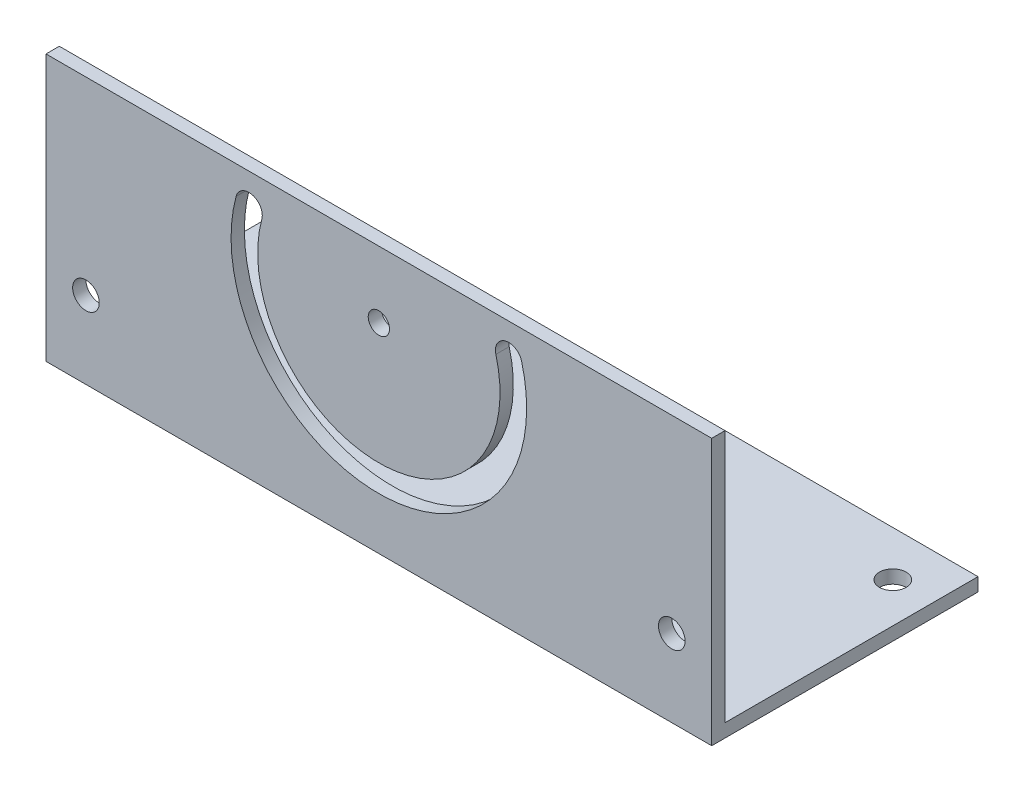
ISO-10303-21;
HEADER;
FILE_DESCRIPTION(('STEP AP214'),'2;1');
FILE_NAME('part.step','',(''),(''),'','','');
FILE_SCHEMA(('AUTOMOTIVE_DESIGN { 1 0 10303 214 1 1 1 1 }'));
ENDSEC;
DATA;
#1=APPLICATION_CONTEXT('core data for automotive mechanical design processes');
#2=APPLICATION_PROTOCOL_DEFINITION('international standard','automotive_design',2000,#1);
#3=PRODUCT_CONTEXT('',#1,'mechanical');
#4=PRODUCT('Part','Part','',(#3));
#5=PRODUCT_RELATED_PRODUCT_CATEGORY('part','',(#4));
#6=PRODUCT_DEFINITION_FORMATION('','',#4);
#7=PRODUCT_DEFINITION_CONTEXT('part definition',#1,'design');
#8=PRODUCT_DEFINITION('design','',#6,#7);
#9=PRODUCT_DEFINITION_SHAPE('','',#8);
#10=(LENGTH_UNIT() NAMED_UNIT(*) SI_UNIT(.MILLI.,.METRE.));
#11=(NAMED_UNIT(*) PLANE_ANGLE_UNIT() SI_UNIT($,.RADIAN.));
#12=(NAMED_UNIT(*) SI_UNIT($,.STERADIAN.) SOLID_ANGLE_UNIT());
#13=UNCERTAINTY_MEASURE_WITH_UNIT(LENGTH_MEASURE(1.E-05),#10,'distance_accuracy_value','');
#14=(GEOMETRIC_REPRESENTATION_CONTEXT(3) GLOBAL_UNCERTAINTY_ASSIGNED_CONTEXT((#13)) GLOBAL_UNIT_ASSIGNED_CONTEXT((#10,
#11,#12)) REPRESENTATION_CONTEXT('',''));
#15=CARTESIAN_POINT('',(0.,0.,0.));
#16=DIRECTION('',(0.,0.,1.));
#17=DIRECTION('',(1.,0.,0.));
#18=AXIS2_PLACEMENT_3D('',#15,#16,#17);
#19=CARTESIAN_POINT('',(15.,75.,0.));
#20=DIRECTION('',(0.,0.,-1.));
#21=DIRECTION('',(-1.,0.,0.));
#22=AXIS2_PLACEMENT_3D('',#19,#20,#21);
#23=CYLINDRICAL_SURFACE('',#22,55.5);
#24=DIRECTION('',(0.,0.,-1.));
#25=VECTOR('',#24,1.);
#26=CARTESIAN_POINT('',(-38.6088833590433,89.3644570031899,0.));
#27=LINE('',#26,#25);
#28=CARTESIAN_POINT('',(-38.6088833590433,89.3644570031899,-5.));
#29=VERTEX_POINT('',#28);
#30=CARTESIAN_POINT('',(-38.6088833590433,89.3644570031899,0.));
#31=VERTEX_POINT('',#30);
#32=EDGE_CURVE('E219',#29,#31,#27,.F.);
#33=ORIENTED_EDGE('',*,*,#32,.T.);
#34=CARTESIAN_POINT('',(15.,75.,0.));
#35=DIRECTION('',(0.,0.,-1.));
#36=DIRECTION('',(-1.,0.,0.));
#37=AXIS2_PLACEMENT_3D('',#34,#35,#36);
#38=CIRCLE('',#37,55.5);
#39=CARTESIAN_POINT('',(68.6088833590433,89.3644570031899,0.));
#40=VERTEX_POINT('',#39);
#41=EDGE_CURVE('E241',#40,#31,#38,.T.);
#42=ORIENTED_EDGE('',*,*,#41,.F.);
#43=DIRECTION('',(0.,0.,-1.));
#44=VECTOR('',#43,1.);
#45=CARTESIAN_POINT('',(68.6088833590433,89.3644570031899,0.));
#46=LINE('',#45,#44);
#47=CARTESIAN_POINT('',(68.6088833590433,89.3644570031899,-5.));
#48=VERTEX_POINT('',#47);
#49=EDGE_CURVE('E255',#40,#48,#46,.T.);
#50=ORIENTED_EDGE('',*,*,#49,.T.);
#51=CARTESIAN_POINT('',(15.,75.,-5.));
#52=DIRECTION('',(0.,0.,-1.));
#53=DIRECTION('',(0.,1.,0.));
#54=AXIS2_PLACEMENT_3D('',#51,#52,#53);
#55=CIRCLE('',#54,55.5);
#56=EDGE_CURVE('E157',#29,#48,#55,.F.);
#57=ORIENTED_EDGE('',*,*,#56,.F.);
#58=EDGE_LOOP('',(#33,#42,#50,#57));
#59=FACE_BOUND('',#58,.T.);
#60=ADVANCED_FACE('F49',(#59),#23,.F.);
#61=CARTESIAN_POINT('',(-33.779254227598,88.0703617776773,0.));
#62=DIRECTION('',(0.,0.,-1.));
#63=DIRECTION('',(-1.,0.,0.));
#64=AXIS2_PLACEMENT_3D('',#61,#62,#63);
#65=CYLINDRICAL_SURFACE('',#64,5.);
#66=DIRECTION('',(0.,0.,-1.));
#67=VECTOR('',#66,1.);
#68=CARTESIAN_POINT('',(-28.9496250961526,86.7762665521647,0.));
#69=LINE('',#68,#67);
#70=CARTESIAN_POINT('',(-28.9496250961526,86.7762665521647,0.));
#71=VERTEX_POINT('',#70);
#72=CARTESIAN_POINT('',(-28.9496250961526,86.7762665521647,-5.));
#73=VERTEX_POINT('',#72);
#74=EDGE_CURVE('E256',#71,#73,#69,.T.);
#75=ORIENTED_EDGE('',*,*,#74,.F.);
#76=CARTESIAN_POINT('',(-33.779254227598,88.0703617776773,0.));
#77=DIRECTION('',(0.,0.,-1.));
#78=DIRECTION('',(-1.,0.,0.));
#79=AXIS2_PLACEMENT_3D('',#76,#77,#78);
#80=CIRCLE('',#79,5.);
#81=EDGE_CURVE('E267',#31,#71,#80,.T.);
#82=ORIENTED_EDGE('',*,*,#81,.F.);
#83=ORIENTED_EDGE('',*,*,#32,.F.);
#84=CARTESIAN_POINT('',(-33.779254227598,88.0703617776773,-5.));
#85=DIRECTION('',(0.,0.,-1.));
#86=DIRECTION('',(0.,1.,0.));
#87=AXIS2_PLACEMENT_3D('',#84,#85,#86);
#88=CIRCLE('',#87,5.);
#89=EDGE_CURVE('E274',#73,#29,#88,.F.);
#90=ORIENTED_EDGE('',*,*,#89,.F.);
#91=EDGE_LOOP('',(#75,#82,#83,#90));
#92=FACE_BOUND('',#91,.T.);
#93=ADVANCED_FACE('F454',(#92),#65,.F.);
#94=CARTESIAN_POINT('',(15.,75.,0.));
#95=DIRECTION('',(0.,0.,-1.));
#96=DIRECTION('',(-1.,0.,0.));
#97=AXIS2_PLACEMENT_3D('',#94,#95,#96);
#98=CYLINDRICAL_SURFACE('',#97,45.5);
#99=CARTESIAN_POINT('',(15.,75.,0.));
#100=DIRECTION('',(0.,0.,-1.));
#101=DIRECTION('',(-1.,0.,0.));
#102=AXIS2_PLACEMENT_3D('',#99,#100,#101);
#103=CIRCLE('',#102,45.5);
#104=CARTESIAN_POINT('',(58.9496250961527,86.7762665521647,0.));
#105=VERTEX_POINT('',#104);
#106=EDGE_CURVE('E264',#71,#105,#103,.F.);
#107=ORIENTED_EDGE('',*,*,#106,.F.);
#108=ORIENTED_EDGE('',*,*,#74,.T.);
#109=CARTESIAN_POINT('',(15.,75.,-5.));
#110=DIRECTION('',(0.,0.,-1.));
#111=DIRECTION('',(0.,1.,0.));
#112=AXIS2_PLACEMENT_3D('',#109,#110,#111);
#113=CIRCLE('',#112,45.5);
#114=CARTESIAN_POINT('',(58.9496250961527,86.7762665521647,-5.));
#115=VERTEX_POINT('',#114);
#116=EDGE_CURVE('E312',#115,#73,#113,.T.);
#117=ORIENTED_EDGE('',*,*,#116,.F.);
#118=DIRECTION('',(0.,0.,-1.));
#119=VECTOR('',#118,1.);
#120=CARTESIAN_POINT('',(58.9496250961527,86.7762665521647,0.));
#121=LINE('',#120,#119);
#122=EDGE_CURVE('E253',#115,#105,#121,.F.);
#123=ORIENTED_EDGE('',*,*,#122,.T.);
#124=EDGE_LOOP('',(#107,#108,#117,#123));
#125=FACE_BOUND('',#124,.T.);
#126=ADVANCED_FACE('F457',(#125),#98,.T.);
#127=CARTESIAN_POINT('',(63.779254227598,88.0703617776773,0.));
#128=DIRECTION('',(0.,0.,-1.));
#129=DIRECTION('',(-1.,0.,0.));
#130=AXIS2_PLACEMENT_3D('',#127,#128,#129);
#131=CYLINDRICAL_SURFACE('',#130,5.);
#132=ORIENTED_EDGE('',*,*,#49,.F.);
#133=CARTESIAN_POINT('',(63.779254227598,88.0703617776773,0.));
#134=DIRECTION('',(0.,0.,-1.));
#135=DIRECTION('',(-1.,0.,0.));
#136=AXIS2_PLACEMENT_3D('',#133,#134,#135);
#137=CIRCLE('',#136,5.);
#138=EDGE_CURVE('E238',#105,#40,#137,.T.);
#139=ORIENTED_EDGE('',*,*,#138,.F.);
#140=ORIENTED_EDGE('',*,*,#122,.F.);
#141=CARTESIAN_POINT('',(63.779254227598,88.0703617776773,-5.));
#142=DIRECTION('',(0.,0.,-1.));
#143=DIRECTION('',(0.,1.,0.));
#144=AXIS2_PLACEMENT_3D('',#141,#142,#143);
#145=CIRCLE('',#144,5.);
#146=EDGE_CURVE('E315',#48,#115,#145,.F.);
#147=ORIENTED_EDGE('',*,*,#146,.F.);
#148=EDGE_LOOP('',(#132,#139,#140,#147));
#149=FACE_BOUND('',#148,.T.);
#150=ADVANCED_FACE('F461',(#149),#131,.F.);
#151=CARTESIAN_POINT('',(0.,100.,-6.));
#152=DIRECTION('',(0.,1.,0.));
#153=DIRECTION('',(0.,0.,1.));
#154=AXIS2_PLACEMENT_3D('',#151,#152,#153);
#155=PLANE('',#154);
#156=DIRECTION('',(1.,0.,0.));
#157=VECTOR('',#156,1.);
#158=CARTESIAN_POINT('',(0.,100.,-5.));
#159=LINE('',#158,#157);
#160=CARTESIAN_POINT('',(-110.,100.,-5.));
#161=VERTEX_POINT('',#160);
#162=CARTESIAN_POINT('',(140.,100.,-5.));
#163=VERTEX_POINT('',#162);
#164=EDGE_CURVE('E258',#161,#163,#159,.T.);
#165=ORIENTED_EDGE('',*,*,#164,.F.);
#166=DIRECTION('',(0.,0.,1.));
#167=VECTOR('',#166,1.);
#168=CARTESIAN_POINT('',(-110.,100.,-27.91));
#169=LINE('',#168,#167);
#170=CARTESIAN_POINT('',(-110.,100.,0.));
#171=VERTEX_POINT('',#170);
#172=EDGE_CURVE('E233',#171,#161,#169,.F.);
#173=ORIENTED_EDGE('',*,*,#172,.F.);
#174=DIRECTION('',(1.,0.,0.));
#175=VECTOR('',#174,1.);
#176=CARTESIAN_POINT('',(0.,100.,0.));
#177=LINE('',#176,#175);
#178=CARTESIAN_POINT('',(140.,100.,0.));
#179=VERTEX_POINT('',#178);
#180=EDGE_CURVE('E239',#179,#171,#177,.F.);
#181=ORIENTED_EDGE('',*,*,#180,.F.);
#182=DIRECTION('',(0.,0.,-1.));
#183=VECTOR('',#182,1.);
#184=CARTESIAN_POINT('',(140.,100.,-27.91));
#185=LINE('',#184,#183);
#186=EDGE_CURVE('E245',#163,#179,#185,.F.);
#187=ORIENTED_EDGE('',*,*,#186,.F.);
#188=EDGE_LOOP('',(#165,#173,#181,#187));
#189=FACE_BOUND('',#188,.T.);
#190=ADVANCED_FACE('F331',(#189),#155,.T.);
#191=CARTESIAN_POINT('',(0.,6.,-5.00000000000001));
#192=DIRECTION('',(0.,0.,-1.));
#193=DIRECTION('',(0.,1.,0.));
#194=AXIS2_PLACEMENT_3D('',#191,#192,#193);
#195=PLANE('',#194);
#196=ORIENTED_EDGE('',*,*,#116,.T.);
#197=ORIENTED_EDGE('',*,*,#89,.T.);
#198=ORIENTED_EDGE('',*,*,#56,.T.);
#199=ORIENTED_EDGE('',*,*,#146,.T.);
#200=EDGE_LOOP('',(#196,#197,#198,#199));
#201=FACE_BOUND('',#200,.T.);
#202=DIRECTION('',(1.,0.,0.));
#203=VECTOR('',#202,1.);
#204=CARTESIAN_POINT('',(0.,5.,-5.00000000000001));
#205=LINE('',#204,#203);
#206=CARTESIAN_POINT('',(-110.,5.,-5.00000000000001));
#207=VERTEX_POINT('',#206);
#208=CARTESIAN_POINT('',(140.,5.,-5.00000000000001));
#209=VERTEX_POINT('',#208);
#210=EDGE_CURVE('E272',#207,#209,#205,.T.);
#211=ORIENTED_EDGE('',*,*,#210,.F.);
#212=DIRECTION('',(0.,-1.,0.));
#213=VECTOR('',#212,1.);
#214=CARTESIAN_POINT('',(-110.,27.91,-5.00000000000001));
#215=LINE('',#214,#213);
#216=EDGE_CURVE('E236',#161,#207,#215,.T.);
#217=ORIENTED_EDGE('',*,*,#216,.F.);
#218=ORIENTED_EDGE('',*,*,#164,.T.);
#219=DIRECTION('',(0.,1.,0.));
#220=VECTOR('',#219,1.);
#221=CARTESIAN_POINT('',(140.,27.91,-5.00000000000001));
#222=LINE('',#221,#220);
#223=EDGE_CURVE('E247',#209,#163,#222,.T.);
#224=ORIENTED_EDGE('',*,*,#223,.F.);
#225=EDGE_LOOP('',(#211,#217,#218,#224));
#226=FACE_BOUND('',#225,.T.);
#227=CARTESIAN_POINT('',(15.,75.,-5.));
#228=DIRECTION('',(0.,0.,-1.));
#229=DIRECTION('',(0.,1.,0.));
#230=AXIS2_PLACEMENT_3D('',#227,#228,#229);
#231=CIRCLE('',#230,4.);
#232=CARTESIAN_POINT('',(15.,79.,-5.));
#233=VERTEX_POINT('',#232);
#234=EDGE_CURVE('E216',#233,#233,#231,.T.);
#235=ORIENTED_EDGE('',*,*,#234,.F.);
#236=EDGE_LOOP('',(#235));
#237=FACE_BOUND('',#236,.T.);
#238=CARTESIAN_POINT('',(-95.,29.,-5.00000000000001));
#239=DIRECTION('',(0.,0.,-1.));
#240=DIRECTION('',(0.,1.,0.));
#241=AXIS2_PLACEMENT_3D('',#238,#239,#240);
#242=CIRCLE('',#241,5.);
#243=CARTESIAN_POINT('',(-95.,34.,-5.00000000000001));
#244=VERTEX_POINT('',#243);
#245=EDGE_CURVE('E212',#244,#244,#242,.T.);
#246=ORIENTED_EDGE('',*,*,#245,.F.);
#247=EDGE_LOOP('',(#246));
#248=FACE_BOUND('',#247,.T.);
#249=CARTESIAN_POINT('',(125.,29.,-5.00000000000001));
#250=DIRECTION('',(0.,0.,-1.));
#251=DIRECTION('',(0.,1.,0.));
#252=AXIS2_PLACEMENT_3D('',#249,#250,#251);
#253=CIRCLE('',#252,5.);
#254=CARTESIAN_POINT('',(125.,34.,-5.00000000000001));
#255=VERTEX_POINT('',#254);
#256=EDGE_CURVE('E53',#255,#255,#253,.T.);
#257=ORIENTED_EDGE('',*,*,#256,.F.);
#258=EDGE_LOOP('',(#257));
#259=FACE_BOUND('',#258,.T.);
#260=ADVANCED_FACE('F51',(#201,#226,#237,#248,#259),#195,.T.);
#261=CARTESIAN_POINT('',(0.,5.00000000000003,-100.));
#262=DIRECTION('',(0.,1.,0.));
#263=DIRECTION('',(0.,0.,1.));
#264=AXIS2_PLACEMENT_3D('',#261,#262,#263);
#265=PLANE('',#264);
#266=DIRECTION('',(1.,0.,0.));
#267=VECTOR('',#266,1.);
#268=CARTESIAN_POINT('',(0.,5.00000000000003,-100.));
#269=LINE('',#268,#267);
#270=CARTESIAN_POINT('',(-110.,5.00000000000003,-100.));
#271=VERTEX_POINT('',#270);
#272=CARTESIAN_POINT('',(140.,5.00000000000003,-100.));
#273=VERTEX_POINT('',#272);
#274=EDGE_CURVE('E252',#271,#273,#269,.T.);
#275=ORIENTED_EDGE('',*,*,#274,.F.);
#276=DIRECTION('',(0.,0.,-1.));
#277=VECTOR('',#276,1.);
#278=CARTESIAN_POINT('',(-110.,5.00000000000001,-27.91));
#279=LINE('',#278,#277);
#280=EDGE_CURVE('E232',#207,#271,#279,.T.);
#281=ORIENTED_EDGE('',*,*,#280,.F.);
#282=ORIENTED_EDGE('',*,*,#210,.T.);
#283=DIRECTION('',(0.,0.,1.));
#284=VECTOR('',#283,1.);
#285=CARTESIAN_POINT('',(140.,5.00000000000001,-27.91));
#286=LINE('',#285,#284);
#287=EDGE_CURVE('E251',#273,#209,#286,.T.);
#288=ORIENTED_EDGE('',*,*,#287,.F.);
#289=EDGE_LOOP('',(#275,#281,#282,#288));
#290=FACE_BOUND('',#289,.T.);
#291=CARTESIAN_POINT('',(-95.,5.00000000000002,-83.));
#292=DIRECTION('',(0.,1.,0.));
#293=DIRECTION('',(0.,0.,1.));
#294=AXIS2_PLACEMENT_3D('',#291,#292,#293);
#295=CIRCLE('',#294,5.00000000000001);
#296=CARTESIAN_POINT('',(-95.,5.00000000000002,-78.));
#297=VERTEX_POINT('',#296);
#298=EDGE_CURVE('E205',#297,#297,#295,.T.);
#299=ORIENTED_EDGE('',*,*,#298,.F.);
#300=EDGE_LOOP('',(#299));
#301=FACE_BOUND('',#300,.T.);
#302=CARTESIAN_POINT('',(125.,5.00000000000002,-83.));
#303=DIRECTION('',(0.,1.,0.));
#304=DIRECTION('',(0.,0.,1.));
#305=AXIS2_PLACEMENT_3D('',#302,#303,#304);
#306=CIRCLE('',#305,4.99999999999999);
#307=CARTESIAN_POINT('',(125.,5.00000000000002,-78.));
#308=VERTEX_POINT('',#307);
#309=EDGE_CURVE('E184',#308,#308,#306,.T.);
#310=ORIENTED_EDGE('',*,*,#309,.F.);
#311=EDGE_LOOP('',(#310));
#312=FACE_BOUND('',#311,.T.);
#313=CARTESIAN_POINT('',(-5.,5.00000000000002,-83.));
#314=DIRECTION('',(0.,1.,0.));
#315=DIRECTION('',(0.,0.,1.));
#316=AXIS2_PLACEMENT_3D('',#313,#314,#315);
#317=CIRCLE('',#316,5.);
#318=CARTESIAN_POINT('',(-5.,5.00000000000003,-88.));
#319=VERTEX_POINT('',#318);
#320=CARTESIAN_POINT('',(-5.,5.00000000000002,-78.));
#321=VERTEX_POINT('',#320);
#322=EDGE_CURVE('E197',#319,#321,#317,.T.);
#323=ORIENTED_EDGE('',*,*,#322,.F.);
#324=DIRECTION('',(-1.,0.,0.));
#325=VECTOR('',#324,1.);
#326=CARTESIAN_POINT('',(0.,5.00000000000003,-88.));
#327=LINE('',#326,#325);
#328=CARTESIAN_POINT('',(5.,5.00000000000003,-88.));
#329=VERTEX_POINT('',#328);
#330=EDGE_CURVE('E175',#329,#319,#327,.T.);
#331=ORIENTED_EDGE('',*,*,#330,.F.);
#332=CARTESIAN_POINT('',(5.,5.00000000000002,-83.));
#333=DIRECTION('',(0.,1.,0.));
#334=DIRECTION('',(0.,0.,1.));
#335=AXIS2_PLACEMENT_3D('',#332,#333,#334);
#336=CIRCLE('',#335,5.);
#337=CARTESIAN_POINT('',(5.,5.00000000000002,-78.));
#338=VERTEX_POINT('',#337);
#339=EDGE_CURVE('E174',#338,#329,#336,.T.);
#340=ORIENTED_EDGE('',*,*,#339,.F.);
#341=DIRECTION('',(1.,0.,0.));
#342=VECTOR('',#341,1.);
#343=CARTESIAN_POINT('',(0.,5.00000000000002,-78.));
#344=LINE('',#343,#342);
#345=EDGE_CURVE('E170',#321,#338,#344,.T.);
#346=ORIENTED_EDGE('',*,*,#345,.F.);
#347=EDGE_LOOP('',(#323,#331,#340,#346));
#348=FACE_BOUND('',#347,.T.);
#349=CARTESIAN_POINT('',(25.,5.00000000000002,-83.));
#350=DIRECTION('',(0.,1.,0.));
#351=DIRECTION('',(0.,0.,1.));
#352=AXIS2_PLACEMENT_3D('',#349,#350,#351);
#353=CIRCLE('',#352,5.);
#354=CARTESIAN_POINT('',(25.,5.00000000000003,-88.));
#355=VERTEX_POINT('',#354);
#356=CARTESIAN_POINT('',(25.,5.00000000000002,-78.));
#357=VERTEX_POINT('',#356);
#358=EDGE_CURVE('E295',#355,#357,#353,.T.);
#359=ORIENTED_EDGE('',*,*,#358,.F.);
#360=DIRECTION('',(-1.,0.,0.));
#361=VECTOR('',#360,1.);
#362=CARTESIAN_POINT('',(0.,5.00000000000003,-88.));
#363=LINE('',#362,#361);
#364=CARTESIAN_POINT('',(35.,5.00000000000003,-88.));
#365=VERTEX_POINT('',#364);
#366=EDGE_CURVE('E309',#365,#355,#363,.T.);
#367=ORIENTED_EDGE('',*,*,#366,.F.);
#368=CARTESIAN_POINT('',(35.,5.00000000000002,-83.));
#369=DIRECTION('',(0.,1.,0.));
#370=DIRECTION('',(0.,0.,1.));
#371=AXIS2_PLACEMENT_3D('',#368,#369,#370);
#372=CIRCLE('',#371,5.);
#373=CARTESIAN_POINT('',(35.,5.00000000000002,-78.));
#374=VERTEX_POINT('',#373);
#375=EDGE_CURVE('E305',#374,#365,#372,.T.);
#376=ORIENTED_EDGE('',*,*,#375,.F.);
#377=DIRECTION('',(1.,0.,0.));
#378=VECTOR('',#377,1.);
#379=CARTESIAN_POINT('',(0.,5.00000000000002,-78.));
#380=LINE('',#379,#378);
#381=EDGE_CURVE('E300',#357,#374,#380,.T.);
#382=ORIENTED_EDGE('',*,*,#381,.F.);
#383=EDGE_LOOP('',(#359,#367,#376,#382));
#384=FACE_BOUND('',#383,.T.);
#385=ADVANCED_FACE('F330',(#290,#301,#312,#348,#384),#265,.T.);
#386=CARTESIAN_POINT('',(0.,0.,-100.));
#387=DIRECTION('',(0.,0.,-1.));
#388=DIRECTION('',(0.,1.,0.));
#389=AXIS2_PLACEMENT_3D('',#386,#387,#388);
#390=PLANE('',#389);
#391=DIRECTION('',(1.,0.,0.));
#392=VECTOR('',#391,1.);
#393=CARTESIAN_POINT('',(0.,0.,-100.));
#394=LINE('',#393,#392);
#395=CARTESIAN_POINT('',(-110.,0.,-100.));
#396=VERTEX_POINT('',#395);
#397=CARTESIAN_POINT('',(140.,0.,-100.));
#398=VERTEX_POINT('',#397);
#399=EDGE_CURVE('E226',#396,#398,#394,.T.);
#400=ORIENTED_EDGE('',*,*,#399,.F.);
#401=DIRECTION('',(0.,1.,0.));
#402=VECTOR('',#401,1.);
#403=CARTESIAN_POINT('',(-110.,27.91,-100.));
#404=LINE('',#403,#402);
#405=EDGE_CURVE('E229',#271,#396,#404,.F.);
#406=ORIENTED_EDGE('',*,*,#405,.F.);
#407=ORIENTED_EDGE('',*,*,#274,.T.);
#408=DIRECTION('',(0.,1.,0.));
#409=VECTOR('',#408,1.);
#410=CARTESIAN_POINT('',(140.,27.91,-100.));
#411=LINE('',#410,#409);
#412=EDGE_CURVE('E248',#398,#273,#411,.T.);
#413=ORIENTED_EDGE('',*,*,#412,.F.);
#414=EDGE_LOOP('',(#400,#406,#407,#413));
#415=FACE_BOUND('',#414,.T.);
#416=ADVANCED_FACE('F355',(#415),#390,.T.);
#417=CARTESIAN_POINT('',(140.,27.91,-27.91));
#418=DIRECTION('',(1.,0.,0.));
#419=DIRECTION('',(0.,0.,-1.));
#420=AXIS2_PLACEMENT_3D('',#417,#418,#419);
#421=PLANE('',#420);
#422=ORIENTED_EDGE('',*,*,#223,.T.);
#423=ORIENTED_EDGE('',*,*,#186,.T.);
#424=DIRECTION('',(0.,1.,0.));
#425=VECTOR('',#424,1.);
#426=CARTESIAN_POINT('',(140.,100.,0.));
#427=LINE('',#426,#425);
#428=CARTESIAN_POINT('',(140.,0.,0.));
#429=VERTEX_POINT('',#428);
#430=EDGE_CURVE('E242',#429,#179,#427,.T.);
#431=ORIENTED_EDGE('',*,*,#430,.F.);
#432=DIRECTION('',(0.,0.,-1.));
#433=VECTOR('',#432,1.);
#434=CARTESIAN_POINT('',(140.,0.,0.));
#435=LINE('',#434,#433);
#436=EDGE_CURVE('E223',#398,#429,#435,.F.);
#437=ORIENTED_EDGE('',*,*,#436,.F.);
#438=ORIENTED_EDGE('',*,*,#412,.T.);
#439=ORIENTED_EDGE('',*,*,#287,.T.);
#440=EDGE_LOOP('',(#422,#423,#431,#437,#438,#439));
#441=FACE_BOUND('',#440,.T.);
#442=ADVANCED_FACE('F346',(#441),#421,.T.);
#443=CARTESIAN_POINT('',(0.,100.,0.));
#444=DIRECTION('',(0.,0.,1.));
#445=DIRECTION('',(1.,0.,0.));
#446=AXIS2_PLACEMENT_3D('',#443,#444,#445);
#447=PLANE('',#446);
#448=ORIENTED_EDGE('',*,*,#106,.T.);
#449=ORIENTED_EDGE('',*,*,#138,.T.);
#450=ORIENTED_EDGE('',*,*,#41,.T.);
#451=ORIENTED_EDGE('',*,*,#81,.T.);
#452=EDGE_LOOP('',(#448,#449,#450,#451));
#453=FACE_BOUND('',#452,.T.);
#454=ORIENTED_EDGE('',*,*,#180,.T.);
#455=DIRECTION('',(0.,1.,0.));
#456=VECTOR('',#455,1.);
#457=CARTESIAN_POINT('',(-110.,27.91,0.));
#458=LINE('',#457,#456);
#459=CARTESIAN_POINT('',(-110.,0.,0.));
#460=VERTEX_POINT('',#459);
#461=EDGE_CURVE('E68',#460,#171,#458,.T.);
#462=ORIENTED_EDGE('',*,*,#461,.F.);
#463=DIRECTION('',(1.,0.,0.));
#464=VECTOR('',#463,1.);
#465=CARTESIAN_POINT('',(0.,0.,0.));
#466=LINE('',#465,#464);
#467=EDGE_CURVE('E59',#429,#460,#466,.F.);
#468=ORIENTED_EDGE('',*,*,#467,.F.);
#469=ORIENTED_EDGE('',*,*,#430,.T.);
#470=EDGE_LOOP('',(#454,#462,#468,#469));
#471=FACE_BOUND('',#470,.T.);
#472=CARTESIAN_POINT('',(15.,75.,0.));
#473=DIRECTION('',(0.,0.,1.));
#474=DIRECTION('',(1.,0.,0.));
#475=AXIS2_PLACEMENT_3D('',#472,#473,#474);
#476=CIRCLE('',#475,4.);
#477=CARTESIAN_POINT('',(19.,75.,0.));
#478=VERTEX_POINT('',#477);
#479=EDGE_CURVE('E217',#478,#478,#476,.F.);
#480=ORIENTED_EDGE('',*,*,#479,.T.);
#481=EDGE_LOOP('',(#480));
#482=FACE_BOUND('',#481,.T.);
#483=CARTESIAN_POINT('',(-95.,29.,0.));
#484=DIRECTION('',(0.,0.,1.));
#485=DIRECTION('',(1.,0.,0.));
#486=AXIS2_PLACEMENT_3D('',#483,#484,#485);
#487=CIRCLE('',#486,5.);
#488=CARTESIAN_POINT('',(-90.,29.,0.));
#489=VERTEX_POINT('',#488);
#490=EDGE_CURVE('E213',#489,#489,#487,.F.);
#491=ORIENTED_EDGE('',*,*,#490,.T.);
#492=EDGE_LOOP('',(#491));
#493=FACE_BOUND('',#492,.T.);
#494=CARTESIAN_POINT('',(125.,29.,0.));
#495=DIRECTION('',(0.,0.,1.));
#496=DIRECTION('',(1.,0.,0.));
#497=AXIS2_PLACEMENT_3D('',#494,#495,#496);
#498=CIRCLE('',#497,5.);
#499=CARTESIAN_POINT('',(130.,29.,0.));
#500=VERTEX_POINT('',#499);
#501=EDGE_CURVE('E209',#500,#500,#498,.F.);
#502=ORIENTED_EDGE('',*,*,#501,.T.);
#503=EDGE_LOOP('',(#502));
#504=FACE_BOUND('',#503,.T.);
#505=ADVANCED_FACE('F343',(#453,#471,#482,#493,#504),#447,.T.);
#506=CARTESIAN_POINT('',(-110.,27.91,-27.91));
#507=DIRECTION('',(-1.,0.,0.));
#508=DIRECTION('',(0.,0.,1.));
#509=AXIS2_PLACEMENT_3D('',#506,#507,#508);
#510=PLANE('',#509);
#511=ORIENTED_EDGE('',*,*,#405,.T.);
#512=DIRECTION('',(0.,0.,-1.));
#513=VECTOR('',#512,1.);
#514=CARTESIAN_POINT('',(-110.,0.,0.));
#515=LINE('',#514,#513);
#516=EDGE_CURVE('E14',#460,#396,#515,.T.);
#517=ORIENTED_EDGE('',*,*,#516,.F.);
#518=ORIENTED_EDGE('',*,*,#461,.T.);
#519=ORIENTED_EDGE('',*,*,#172,.T.);
#520=ORIENTED_EDGE('',*,*,#216,.T.);
#521=ORIENTED_EDGE('',*,*,#280,.T.);
#522=EDGE_LOOP('',(#511,#517,#518,#519,#520,#521));
#523=FACE_BOUND('',#522,.T.);
#524=ADVANCED_FACE('F345',(#523),#510,.T.);
#525=CARTESIAN_POINT('',(0.,0.,0.));
#526=DIRECTION('',(0.,-1.,0.));
#527=DIRECTION('',(0.,0.,-1.));
#528=AXIS2_PLACEMENT_3D('',#525,#526,#527);
#529=PLANE('',#528);
#530=ORIENTED_EDGE('',*,*,#467,.T.);
#531=ORIENTED_EDGE('',*,*,#516,.T.);
#532=ORIENTED_EDGE('',*,*,#399,.T.);
#533=ORIENTED_EDGE('',*,*,#436,.T.);
#534=EDGE_LOOP('',(#530,#531,#532,#533));
#535=FACE_BOUND('',#534,.T.);
#536=CARTESIAN_POINT('',(-95.,0.,-83.));
#537=DIRECTION('',(0.,-1.,0.));
#538=DIRECTION('',(0.,0.,-1.));
#539=AXIS2_PLACEMENT_3D('',#536,#537,#538);
#540=CIRCLE('',#539,5.00000000000001);
#541=CARTESIAN_POINT('',(-95.,0.,-88.));
#542=VERTEX_POINT('',#541);
#543=EDGE_CURVE('E206',#542,#542,#540,.F.);
#544=ORIENTED_EDGE('',*,*,#543,.T.);
#545=EDGE_LOOP('',(#544));
#546=FACE_BOUND('',#545,.T.);
#547=CARTESIAN_POINT('',(125.,0.,-83.));
#548=DIRECTION('',(0.,-1.,0.));
#549=DIRECTION('',(0.,0.,-1.));
#550=AXIS2_PLACEMENT_3D('',#547,#548,#549);
#551=CIRCLE('',#550,4.99999999999999);
#552=CARTESIAN_POINT('',(125.,0.,-88.));
#553=VERTEX_POINT('',#552);
#554=EDGE_CURVE('E202',#553,#553,#551,.F.);
#555=ORIENTED_EDGE('',*,*,#554,.T.);
#556=EDGE_LOOP('',(#555));
#557=FACE_BOUND('',#556,.T.);
#558=DIRECTION('',(-1.,0.,0.));
#559=VECTOR('',#558,1.);
#560=CARTESIAN_POINT('',(-5.,0.,-88.));
#561=LINE('',#560,#559);
#562=CARTESIAN_POINT('',(5.,0.,-88.));
#563=VERTEX_POINT('',#562);
#564=CARTESIAN_POINT('',(-5.,0.,-88.));
#565=VERTEX_POINT('',#564);
#566=EDGE_CURVE('E191',#563,#565,#561,.T.);
#567=ORIENTED_EDGE('',*,*,#566,.T.);
#568=CARTESIAN_POINT('',(-5.,0.,-83.));
#569=DIRECTION('',(0.,-1.,0.));
#570=DIRECTION('',(0.,0.,-1.));
#571=AXIS2_PLACEMENT_3D('',#568,#569,#570);
#572=CIRCLE('',#571,5.);
#573=CARTESIAN_POINT('',(-5.,0.,-78.));
#574=VERTEX_POINT('',#573);
#575=EDGE_CURVE('E189',#565,#574,#572,.F.);
#576=ORIENTED_EDGE('',*,*,#575,.T.);
#577=DIRECTION('',(1.,0.,0.));
#578=VECTOR('',#577,1.);
#579=CARTESIAN_POINT('',(-5.,0.,-78.));
#580=LINE('',#579,#578);
#581=CARTESIAN_POINT('',(5.,0.,-78.));
#582=VERTEX_POINT('',#581);
#583=EDGE_CURVE('E167',#574,#582,#580,.T.);
#584=ORIENTED_EDGE('',*,*,#583,.T.);
#585=CARTESIAN_POINT('',(5.,0.,-83.));
#586=DIRECTION('',(0.,-1.,0.));
#587=DIRECTION('',(0.,0.,-1.));
#588=AXIS2_PLACEMENT_3D('',#585,#586,#587);
#589=CIRCLE('',#588,5.);
#590=EDGE_CURVE('E179',#582,#563,#589,.F.);
#591=ORIENTED_EDGE('',*,*,#590,.T.);
#592=EDGE_LOOP('',(#567,#576,#584,#591));
#593=FACE_BOUND('',#592,.T.);
#594=DIRECTION('',(-1.,0.,0.));
#595=VECTOR('',#594,1.);
#596=CARTESIAN_POINT('',(25.,0.,-88.));
#597=LINE('',#596,#595);
#598=CARTESIAN_POINT('',(35.,0.,-88.));
#599=VERTEX_POINT('',#598);
#600=CARTESIAN_POINT('',(25.,0.,-88.));
#601=VERTEX_POINT('',#600);
#602=EDGE_CURVE('E303',#599,#601,#597,.T.);
#603=ORIENTED_EDGE('',*,*,#602,.T.);
#604=CARTESIAN_POINT('',(25.,0.,-83.));
#605=DIRECTION('',(0.,-1.,0.));
#606=DIRECTION('',(0.,0.,-1.));
#607=AXIS2_PLACEMENT_3D('',#604,#605,#606);
#608=CIRCLE('',#607,5.);
#609=CARTESIAN_POINT('',(25.,0.,-78.));
#610=VERTEX_POINT('',#609);
#611=EDGE_CURVE('E416',#601,#610,#608,.F.);
#612=ORIENTED_EDGE('',*,*,#611,.T.);
#613=DIRECTION('',(1.,0.,0.));
#614=VECTOR('',#613,1.);
#615=CARTESIAN_POINT('',(25.,0.,-78.));
#616=LINE('',#615,#614);
#617=CARTESIAN_POINT('',(35.,0.,-78.));
#618=VERTEX_POINT('',#617);
#619=EDGE_CURVE('E410',#610,#618,#616,.T.);
#620=ORIENTED_EDGE('',*,*,#619,.T.);
#621=CARTESIAN_POINT('',(35.,0.,-83.));
#622=DIRECTION('',(0.,-1.,0.));
#623=DIRECTION('',(0.,0.,-1.));
#624=AXIS2_PLACEMENT_3D('',#621,#622,#623);
#625=CIRCLE('',#624,5.);
#626=EDGE_CURVE('E198',#618,#599,#625,.F.);
#627=ORIENTED_EDGE('',*,*,#626,.T.);
#628=EDGE_LOOP('',(#603,#612,#620,#627));
#629=FACE_BOUND('',#628,.T.);
#630=ADVANCED_FACE('F186',(#535,#546,#557,#593,#629),#529,.T.);
#631=CARTESIAN_POINT('',(15.,75.,14.8492424049175));
#632=DIRECTION('',(0.,0.,-1.));
#633=DIRECTION('',(0.,1.,0.));
#634=AXIS2_PLACEMENT_3D('',#631,#632,#633);
#635=CYLINDRICAL_SURFACE('',#634,4.);
#636=ORIENTED_EDGE('',*,*,#234,.T.);
#637=EDGE_LOOP('',(#636));
#638=FACE_BOUND('',#637,.T.);
#639=ORIENTED_EDGE('',*,*,#479,.F.);
#640=EDGE_LOOP('',(#639));
#641=FACE_BOUND('',#640,.T.);
#642=ADVANCED_FACE('F359',(#638,#641),#635,.F.);
#643=CARTESIAN_POINT('',(-95.,29.,14.8492424049175));
#644=DIRECTION('',(0.,0.,-1.));
#645=DIRECTION('',(0.,1.,0.));
#646=AXIS2_PLACEMENT_3D('',#643,#644,#645);
#647=CYLINDRICAL_SURFACE('',#646,5.);
#648=ORIENTED_EDGE('',*,*,#245,.T.);
#649=EDGE_LOOP('',(#648));
#650=FACE_BOUND('',#649,.T.);
#651=ORIENTED_EDGE('',*,*,#490,.F.);
#652=EDGE_LOOP('',(#651));
#653=FACE_BOUND('',#652,.T.);
#654=ADVANCED_FACE('F325',(#650,#653),#647,.F.);
#655=CARTESIAN_POINT('',(125.,29.,14.8492424049175));
#656=DIRECTION('',(0.,0.,-1.));
#657=DIRECTION('',(0.,1.,0.));
#658=AXIS2_PLACEMENT_3D('',#655,#656,#657);
#659=CYLINDRICAL_SURFACE('',#658,5.);
#660=ORIENTED_EDGE('',*,*,#256,.T.);
#661=EDGE_LOOP('',(#660));
#662=FACE_BOUND('',#661,.T.);
#663=ORIENTED_EDGE('',*,*,#501,.F.);
#664=EDGE_LOOP('',(#663));
#665=FACE_BOUND('',#664,.T.);
#666=ADVANCED_FACE('F336',(#662,#665),#659,.F.);
#667=CARTESIAN_POINT('',(-95.,-23.032585612562,-83.));
#668=DIRECTION('',(0.,1.,0.));
#669=DIRECTION('',(0.,0.,1.));
#670=AXIS2_PLACEMENT_3D('',#667,#668,#669);
#671=CYLINDRICAL_SURFACE('',#670,5.00000000000001);
#672=ORIENTED_EDGE('',*,*,#298,.T.);
#673=EDGE_LOOP('',(#672));
#674=FACE_BOUND('',#673,.T.);
#675=ORIENTED_EDGE('',*,*,#543,.F.);
#676=EDGE_LOOP('',(#675));
#677=FACE_BOUND('',#676,.T.);
#678=ADVANCED_FACE('F339',(#674,#677),#671,.F.);
#679=CARTESIAN_POINT('',(125.,-23.032585612562,-83.));
#680=DIRECTION('',(0.,1.,0.));
#681=DIRECTION('',(0.,0.,1.));
#682=AXIS2_PLACEMENT_3D('',#679,#680,#681);
#683=CYLINDRICAL_SURFACE('',#682,4.99999999999999);
#684=ORIENTED_EDGE('',*,*,#309,.T.);
#685=EDGE_LOOP('',(#684));
#686=FACE_BOUND('',#685,.T.);
#687=ORIENTED_EDGE('',*,*,#554,.F.);
#688=EDGE_LOOP('',(#687));
#689=FACE_BOUND('',#688,.T.);
#690=ADVANCED_FACE('F373',(#686,#689),#683,.F.);
#691=CARTESIAN_POINT('',(-5.,-23.032585612562,-83.));
#692=DIRECTION('',(0.,1.,0.));
#693=DIRECTION('',(0.,0.,1.));
#694=AXIS2_PLACEMENT_3D('',#691,#692,#693);
#695=CYLINDRICAL_SURFACE('',#694,5.);
#696=ORIENTED_EDGE('',*,*,#575,.F.);
#697=DIRECTION('',(0.,1.,0.));
#698=VECTOR('',#697,1.);
#699=CARTESIAN_POINT('',(-5.,-23.032585612562,-88.));
#700=LINE('',#699,#698);
#701=EDGE_CURVE('E195',#565,#319,#700,.T.);
#702=ORIENTED_EDGE('',*,*,#701,.T.);
#703=ORIENTED_EDGE('',*,*,#322,.T.);
#704=DIRECTION('',(0.,1.,0.));
#705=VECTOR('',#704,1.);
#706=CARTESIAN_POINT('',(-5.,-23.032585612562,-78.));
#707=LINE('',#706,#705);
#708=EDGE_CURVE('E200',#574,#321,#707,.T.);
#709=ORIENTED_EDGE('',*,*,#708,.F.);
#710=EDGE_LOOP('',(#696,#702,#703,#709));
#711=FACE_BOUND('',#710,.T.);
#712=ADVANCED_FACE('F377',(#711),#695,.F.);
#713=CARTESIAN_POINT('',(-5.,-23.032585612562,-88.));
#714=DIRECTION('',(0.,0.,-1.));
#715=DIRECTION('',(0.,1.,0.));
#716=AXIS2_PLACEMENT_3D('',#713,#714,#715);
#717=PLANE('',#716);
#718=ORIENTED_EDGE('',*,*,#566,.F.);
#719=DIRECTION('',(0.,1.,0.));
#720=VECTOR('',#719,1.);
#721=CARTESIAN_POINT('',(5.,-23.032585612562,-88.));
#722=LINE('',#721,#720);
#723=EDGE_CURVE('E181',#563,#329,#722,.T.);
#724=ORIENTED_EDGE('',*,*,#723,.T.);
#725=ORIENTED_EDGE('',*,*,#330,.T.);
#726=ORIENTED_EDGE('',*,*,#701,.F.);
#727=EDGE_LOOP('',(#718,#724,#725,#726));
#728=FACE_BOUND('',#727,.T.);
#729=ADVANCED_FACE('F381',(#728),#717,.F.);
#730=CARTESIAN_POINT('',(5.,-23.032585612562,-83.));
#731=DIRECTION('',(0.,1.,0.));
#732=DIRECTION('',(0.,0.,1.));
#733=AXIS2_PLACEMENT_3D('',#730,#731,#732);
#734=CYLINDRICAL_SURFACE('',#733,5.);
#735=ORIENTED_EDGE('',*,*,#590,.F.);
#736=DIRECTION('',(0.,1.,0.));
#737=VECTOR('',#736,1.);
#738=CARTESIAN_POINT('',(5.,-23.032585612562,-78.));
#739=LINE('',#738,#737);
#740=EDGE_CURVE('E163',#582,#338,#739,.T.);
#741=ORIENTED_EDGE('',*,*,#740,.T.);
#742=ORIENTED_EDGE('',*,*,#339,.T.);
#743=ORIENTED_EDGE('',*,*,#723,.F.);
#744=EDGE_LOOP('',(#735,#741,#742,#743));
#745=FACE_BOUND('',#744,.T.);
#746=ADVANCED_FACE('F180',(#745),#734,.F.);
#747=CARTESIAN_POINT('',(-5.,-23.032585612562,-78.));
#748=DIRECTION('',(0.,0.,1.));
#749=DIRECTION('',(0.,-1.,0.));
#750=AXIS2_PLACEMENT_3D('',#747,#748,#749);
#751=PLANE('',#750);
#752=ORIENTED_EDGE('',*,*,#583,.F.);
#753=ORIENTED_EDGE('',*,*,#708,.T.);
#754=ORIENTED_EDGE('',*,*,#345,.T.);
#755=ORIENTED_EDGE('',*,*,#740,.F.);
#756=EDGE_LOOP('',(#752,#753,#754,#755));
#757=FACE_BOUND('',#756,.T.);
#758=ADVANCED_FACE('F165',(#757),#751,.F.);
#759=CARTESIAN_POINT('',(25.,-23.032585612562,-83.));
#760=DIRECTION('',(0.,1.,0.));
#761=DIRECTION('',(0.,0.,1.));
#762=AXIS2_PLACEMENT_3D('',#759,#760,#761);
#763=CYLINDRICAL_SURFACE('',#762,5.);
#764=ORIENTED_EDGE('',*,*,#611,.F.);
#765=DIRECTION('',(0.,1.,0.));
#766=VECTOR('',#765,1.);
#767=CARTESIAN_POINT('',(25.,-23.032585612562,-88.));
#768=LINE('',#767,#766);
#769=EDGE_CURVE('E299',#601,#355,#768,.T.);
#770=ORIENTED_EDGE('',*,*,#769,.T.);
#771=ORIENTED_EDGE('',*,*,#358,.T.);
#772=DIRECTION('',(0.,1.,0.));
#773=VECTOR('',#772,1.);
#774=CARTESIAN_POINT('',(25.,-23.032585612562,-78.));
#775=LINE('',#774,#773);
#776=EDGE_CURVE('E304',#610,#357,#775,.T.);
#777=ORIENTED_EDGE('',*,*,#776,.F.);
#778=EDGE_LOOP('',(#764,#770,#771,#777));
#779=FACE_BOUND('',#778,.T.);
#780=ADVANCED_FACE('F390',(#779),#763,.F.);
#781=CARTESIAN_POINT('',(25.,-23.032585612562,-88.));
#782=DIRECTION('',(0.,0.,-1.));
#783=DIRECTION('',(0.,1.,0.));
#784=AXIS2_PLACEMENT_3D('',#781,#782,#783);
#785=PLANE('',#784);
#786=ORIENTED_EDGE('',*,*,#602,.F.);
#787=DIRECTION('',(0.,1.,0.));
#788=VECTOR('',#787,1.);
#789=CARTESIAN_POINT('',(35.,-23.032585612562,-88.));
#790=LINE('',#789,#788);
#791=EDGE_CURVE('E298',#599,#365,#790,.T.);
#792=ORIENTED_EDGE('',*,*,#791,.T.);
#793=ORIENTED_EDGE('',*,*,#366,.T.);
#794=ORIENTED_EDGE('',*,*,#769,.F.);
#795=EDGE_LOOP('',(#786,#792,#793,#794));
#796=FACE_BOUND('',#795,.T.);
#797=ADVANCED_FACE('F393',(#796),#785,.F.);
#798=CARTESIAN_POINT('',(35.,-23.032585612562,-83.));
#799=DIRECTION('',(0.,1.,0.));
#800=DIRECTION('',(0.,0.,1.));
#801=AXIS2_PLACEMENT_3D('',#798,#799,#800);
#802=CYLINDRICAL_SURFACE('',#801,5.);
#803=ORIENTED_EDGE('',*,*,#626,.F.);
#804=DIRECTION('',(0.,1.,0.));
#805=VECTOR('',#804,1.);
#806=CARTESIAN_POINT('',(35.,-23.032585612562,-78.));
#807=LINE('',#806,#805);
#808=EDGE_CURVE('E308',#618,#374,#807,.T.);
#809=ORIENTED_EDGE('',*,*,#808,.T.);
#810=ORIENTED_EDGE('',*,*,#375,.T.);
#811=ORIENTED_EDGE('',*,*,#791,.F.);
#812=EDGE_LOOP('',(#803,#809,#810,#811));
#813=FACE_BOUND('',#812,.T.);
#814=ADVANCED_FACE('F397',(#813),#802,.F.);
#815=CARTESIAN_POINT('',(25.,-23.032585612562,-78.));
#816=DIRECTION('',(0.,0.,1.));
#817=DIRECTION('',(0.,-1.,0.));
#818=AXIS2_PLACEMENT_3D('',#815,#816,#817);
#819=PLANE('',#818);
#820=ORIENTED_EDGE('',*,*,#619,.F.);
#821=ORIENTED_EDGE('',*,*,#776,.T.);
#822=ORIENTED_EDGE('',*,*,#381,.T.);
#823=ORIENTED_EDGE('',*,*,#808,.F.);
#824=EDGE_LOOP('',(#820,#821,#822,#823));
#825=FACE_BOUND('',#824,.T.);
#826=ADVANCED_FACE('F401',(#825),#819,.F.);
#827=CLOSED_SHELL('',(#60,#93,#126,#150,#190,#260,#385,#416,#442,#505,#524,#630,#642,#654,#666,
#678,#690,#712,#729,#746,#758,#780,#797,#814,#826));
#828=MANIFOLD_SOLID_BREP('B2',#827);
#829=ADVANCED_BREP_SHAPE_REPRESENTATION('',(#18,#828),#14);
#830=SHAPE_DEFINITION_REPRESENTATION(#9,#829);
ENDSEC;
END-ISO-10303-21;
